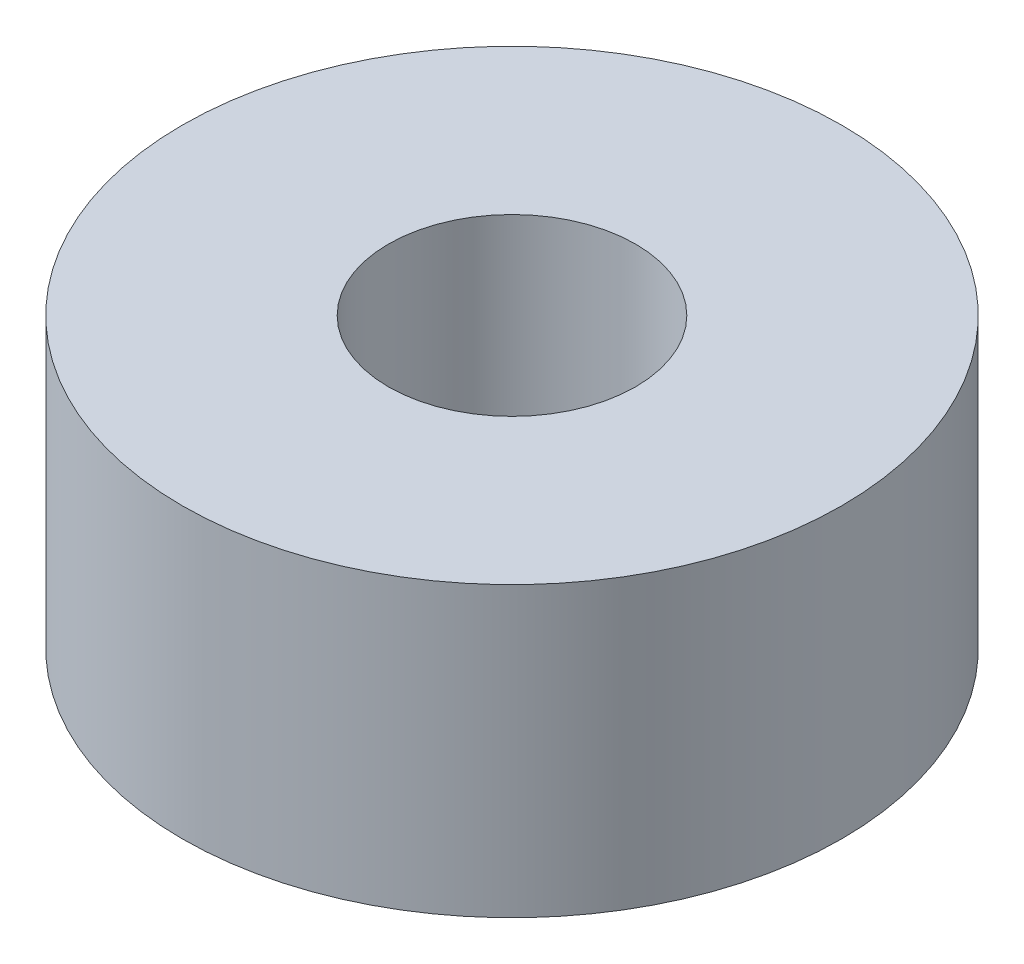
ISO-10303-21;
HEADER;
FILE_DESCRIPTION(('STEP AP214'),'2;1');
FILE_NAME('part.step','',(''),(''),'','','');
FILE_SCHEMA(('AUTOMOTIVE_DESIGN { 1 0 10303 214 1 1 1 1 }'));
ENDSEC;
DATA;
#1=APPLICATION_CONTEXT('core data for automotive mechanical design processes');
#2=APPLICATION_PROTOCOL_DEFINITION('international standard','automotive_design',2000,#1);
#3=PRODUCT_CONTEXT('',#1,'mechanical');
#4=PRODUCT('Part','Part','',(#3));
#5=PRODUCT_RELATED_PRODUCT_CATEGORY('part','',(#4));
#6=PRODUCT_DEFINITION_FORMATION('','',#4);
#7=PRODUCT_DEFINITION_CONTEXT('part definition',#1,'design');
#8=PRODUCT_DEFINITION('design','',#6,#7);
#9=PRODUCT_DEFINITION_SHAPE('','',#8);
#10=(LENGTH_UNIT() NAMED_UNIT(*) SI_UNIT(.MILLI.,.METRE.));
#11=(NAMED_UNIT(*) PLANE_ANGLE_UNIT() SI_UNIT($,.RADIAN.));
#12=(NAMED_UNIT(*) SI_UNIT($,.STERADIAN.) SOLID_ANGLE_UNIT());
#13=UNCERTAINTY_MEASURE_WITH_UNIT(LENGTH_MEASURE(1.E-05),#10,'distance_accuracy_value','');
#14=(GEOMETRIC_REPRESENTATION_CONTEXT(3) GLOBAL_UNCERTAINTY_ASSIGNED_CONTEXT((#13)) GLOBAL_UNIT_ASSIGNED_CONTEXT((#10,
#11,#12)) REPRESENTATION_CONTEXT('',''));
#15=CARTESIAN_POINT('',(0.,0.,0.));
#16=DIRECTION('',(0.,0.,1.));
#17=DIRECTION('',(1.,0.,0.));
#18=AXIS2_PLACEMENT_3D('',#15,#16,#17);
#19=CARTESIAN_POINT('',(0.,3.5,0.));
#20=DIRECTION('',(0.,1.,0.));
#21=DIRECTION('',(0.,0.,1.));
#22=AXIS2_PLACEMENT_3D('',#19,#20,#21);
#23=PLANE('',#22);
#24=CARTESIAN_POINT('',(0.,3.5,0.));
#25=DIRECTION('',(0.,1.,0.));
#26=DIRECTION('',(0.,0.,1.));
#27=AXIS2_PLACEMENT_3D('',#24,#25,#26);
#28=CIRCLE('',#27,4.);
#29=CARTESIAN_POINT('',(0.,3.5,4.));
#30=VERTEX_POINT('',#29);
#31=EDGE_CURVE('E10',#30,#30,#28,.T.);
#32=ORIENTED_EDGE('',*,*,#31,.T.);
#33=EDGE_LOOP('',(#32));
#34=FACE_BOUND('',#33,.T.);
#35=CARTESIAN_POINT('',(0.,3.5,0.));
#36=DIRECTION('',(0.,1.,0.));
#37=DIRECTION('',(0.,0.,1.));
#38=AXIS2_PLACEMENT_3D('',#35,#36,#37);
#39=CIRCLE('',#38,1.5);
#40=CARTESIAN_POINT('',(0.,3.5,1.5));
#41=VERTEX_POINT('',#40);
#42=EDGE_CURVE('E54',#41,#41,#39,.T.);
#43=ORIENTED_EDGE('',*,*,#42,.F.);
#44=EDGE_LOOP('',(#43));
#45=FACE_BOUND('',#44,.T.);
#46=ADVANCED_FACE('F41',(#34,#45),#23,.T.);
#47=CARTESIAN_POINT('',(0.,0.,0.));
#48=DIRECTION('',(0.,1.,0.));
#49=DIRECTION('',(0.,0.,1.));
#50=AXIS2_PLACEMENT_3D('',#47,#48,#49);
#51=PLANE('',#50);
#52=CARTESIAN_POINT('',(0.,0.,0.));
#53=DIRECTION('',(0.,1.,0.));
#54=DIRECTION('',(0.,0.,1.));
#55=AXIS2_PLACEMENT_3D('',#52,#53,#54);
#56=CIRCLE('',#55,4.);
#57=CARTESIAN_POINT('',(0.,0.,4.));
#58=VERTEX_POINT('',#57);
#59=EDGE_CURVE('E45',#58,#58,#56,.T.);
#60=ORIENTED_EDGE('',*,*,#59,.F.);
#61=EDGE_LOOP('',(#60));
#62=FACE_BOUND('',#61,.T.);
#63=CARTESIAN_POINT('',(0.,0.,0.));
#64=DIRECTION('',(0.,1.,0.));
#65=DIRECTION('',(0.,0.,1.));
#66=AXIS2_PLACEMENT_3D('',#63,#64,#65);
#67=CIRCLE('',#66,1.5);
#68=CARTESIAN_POINT('',(0.,0.,1.5));
#69=VERTEX_POINT('',#68);
#70=EDGE_CURVE('E56',#69,#69,#67,.T.);
#71=ORIENTED_EDGE('',*,*,#70,.T.);
#72=EDGE_LOOP('',(#71));
#73=FACE_BOUND('',#72,.T.);
#74=ADVANCED_FACE('F68',(#62,#73),#51,.F.);
#75=CARTESIAN_POINT('',(0.,3.5,0.));
#76=DIRECTION('',(0.,-1.,0.));
#77=DIRECTION('',(0.,0.,-1.));
#78=AXIS2_PLACEMENT_3D('',#75,#76,#77);
#79=CYLINDRICAL_SURFACE('',#78,4.);
#80=ORIENTED_EDGE('',*,*,#31,.F.);
#81=EDGE_LOOP('',(#80));
#82=FACE_BOUND('',#81,.T.);
#83=ORIENTED_EDGE('',*,*,#59,.T.);
#84=EDGE_LOOP('',(#83));
#85=FACE_BOUND('',#84,.T.);
#86=ADVANCED_FACE('F43',(#82,#85),#79,.T.);
#87=CARTESIAN_POINT('',(0.,3.5,0.));
#88=DIRECTION('',(0.,-1.,0.));
#89=DIRECTION('',(0.,0.,-1.));
#90=AXIS2_PLACEMENT_3D('',#87,#88,#89);
#91=CYLINDRICAL_SURFACE('',#90,1.5);
#92=ORIENTED_EDGE('',*,*,#42,.T.);
#93=EDGE_LOOP('',(#92));
#94=FACE_BOUND('',#93,.T.);
#95=ORIENTED_EDGE('',*,*,#70,.F.);
#96=EDGE_LOOP('',(#95));
#97=FACE_BOUND('',#96,.T.);
#98=ADVANCED_FACE('F64',(#94,#97),#91,.F.);
#99=CLOSED_SHELL('',(#46,#74,#86,#98));
#100=MANIFOLD_SOLID_BREP('B2',#99);
#101=ADVANCED_BREP_SHAPE_REPRESENTATION('',(#18,#100),#14);
#102=SHAPE_DEFINITION_REPRESENTATION(#9,#101);
ENDSEC;
END-ISO-10303-21;
